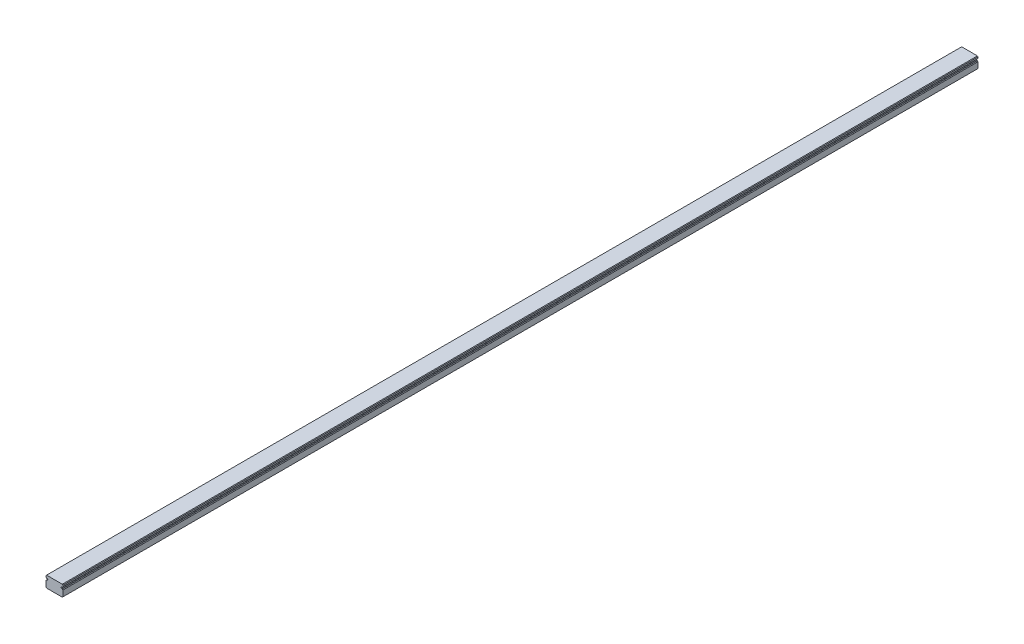
ISO-10303-21;
HEADER;
FILE_DESCRIPTION(('STEP AP214'),'2;1');
FILE_NAME('part.step','',(''),(''),'','','');
FILE_SCHEMA(('AUTOMOTIVE_DESIGN { 1 0 10303 214 1 1 1 1 }'));
ENDSEC;
DATA;
#1=APPLICATION_CONTEXT('core data for automotive mechanical design processes');
#2=APPLICATION_PROTOCOL_DEFINITION('international standard','automotive_design',2000,#1);
#3=PRODUCT_CONTEXT('',#1,'mechanical');
#4=PRODUCT('Part','Part','',(#3));
#5=PRODUCT_RELATED_PRODUCT_CATEGORY('part','',(#4));
#6=PRODUCT_DEFINITION_FORMATION('','',#4);
#7=PRODUCT_DEFINITION_CONTEXT('part definition',#1,'design');
#8=PRODUCT_DEFINITION('design','',#6,#7);
#9=PRODUCT_DEFINITION_SHAPE('','',#8);
#10=(LENGTH_UNIT() NAMED_UNIT(*) SI_UNIT(.MILLI.,.METRE.));
#11=(NAMED_UNIT(*) PLANE_ANGLE_UNIT() SI_UNIT($,.RADIAN.));
#12=(NAMED_UNIT(*) SI_UNIT($,.STERADIAN.) SOLID_ANGLE_UNIT());
#13=UNCERTAINTY_MEASURE_WITH_UNIT(LENGTH_MEASURE(1.E-05),#10,'distance_accuracy_value','');
#14=(GEOMETRIC_REPRESENTATION_CONTEXT(3) GLOBAL_UNCERTAINTY_ASSIGNED_CONTEXT((#13)) GLOBAL_UNIT_ASSIGNED_CONTEXT((#10,
#11,#12)) REPRESENTATION_CONTEXT('',''));
#15=CARTESIAN_POINT('',(0.,0.,0.));
#16=DIRECTION('',(0.,0.,1.));
#17=DIRECTION('',(1.,0.,0.));
#18=AXIS2_PLACEMENT_3D('',#15,#16,#17);
#19=CARTESIAN_POINT('',(-6.00672673016138,1.01169823756327,-325.));
#20=DIRECTION('',(0.,0.,1.));
#21=DIRECTION('',(1.,0.,0.));
#22=AXIS2_PLACEMENT_3D('',#19,#20,#21);
#23=CYLINDRICAL_SURFACE('',#22,0.400000000148);
#24=CARTESIAN_POINT('',(-6.00672673016138,1.01169823756327,325.));
#25=DIRECTION('',(0.,0.,-1.));
#26=DIRECTION('',(1.,0.,0.));
#27=AXIS2_PLACEMENT_3D('',#24,#25,#26);
#28=CIRCLE('',#27,0.400000000148);
#29=CARTESIAN_POINT('',(-5.60677221533139,1.00566614128528,325.));
#30=VERTEX_POINT('',#29);
#31=CARTESIAN_POINT('',(-5.96271720079336,0.614126657287203,325.));
#32=VERTEX_POINT('',#31);
#33=EDGE_CURVE('E251',#30,#32,#28,.T.);
#34=ORIENTED_EDGE('',*,*,#33,.F.);
#35=DIRECTION('',(0.,0.,1.));
#36=VECTOR('',#35,1.);
#37=CARTESIAN_POINT('',(-5.60677221533139,1.00566614128528,-325.));
#38=LINE('',#37,#36);
#39=CARTESIAN_POINT('',(-5.60677221533139,1.00566614128528,-325.));
#40=VERTEX_POINT('',#39);
#41=EDGE_CURVE('E11',#40,#30,#38,.T.);
#42=ORIENTED_EDGE('',*,*,#41,.F.);
#43=CARTESIAN_POINT('',(-6.00672673016138,1.01169823756327,-325.));
#44=DIRECTION('',(0.,0.,-1.));
#45=DIRECTION('',(1.,0.,0.));
#46=AXIS2_PLACEMENT_3D('',#43,#44,#45);
#47=CIRCLE('',#46,0.400000000148);
#48=CARTESIAN_POINT('',(-5.96271720079336,0.614126657287203,-325.));
#49=VERTEX_POINT('',#48);
#50=EDGE_CURVE('E331',#40,#49,#47,.T.);
#51=ORIENTED_EDGE('',*,*,#50,.T.);
#52=DIRECTION('',(0.,0.,1.));
#53=VECTOR('',#52,1.);
#54=CARTESIAN_POINT('',(-5.96271720079336,0.614126657287203,-325.));
#55=LINE('',#54,#53);
#56=EDGE_CURVE('E37',#49,#32,#55,.T.);
#57=ORIENTED_EDGE('',*,*,#56,.T.);
#58=EDGE_LOOP('',(#34,#42,#51,#57));
#59=FACE_BOUND('',#58,.T.);
#60=ADVANCED_FACE('F34',(#59),#23,.F.);
#61=CARTESIAN_POINT('',(-5.500000002035,1.1231155759159,-325.));
#62=DIRECTION('',(-0.73994007340902,0.672672793981928,0.));
#63=DIRECTION('',(-0.672672793981928,-0.73994007340902,0.));
#64=AXIS2_PLACEMENT_3D('',#61,#62,#63);
#65=PLANE('',#64);
#66=DIRECTION('',(-0.672672793981928,-0.73994007340902,0.));
#67=VECTOR('',#66,1.);
#68=CARTESIAN_POINT('',(-5.500000002035,1.1231155759159,325.));
#69=LINE('',#68,#67);
#70=CARTESIAN_POINT('',(-5.500000002035,1.1231155759159,325.));
#71=VERTEX_POINT('',#70);
#72=EDGE_CURVE('E329',#71,#30,#69,.T.);
#73=ORIENTED_EDGE('',*,*,#72,.F.);
#74=DIRECTION('',(0.,0.,1.));
#75=VECTOR('',#74,1.);
#76=CARTESIAN_POINT('',(-5.500000002035,1.1231155759159,-325.));
#77=LINE('',#76,#75);
#78=CARTESIAN_POINT('',(-5.500000002035,1.1231155759159,-325.));
#79=VERTEX_POINT('',#78);
#80=EDGE_CURVE('E43',#79,#71,#77,.T.);
#81=ORIENTED_EDGE('',*,*,#80,.F.);
#82=DIRECTION('',(-0.672672793981928,-0.73994007340902,0.));
#83=VECTOR('',#82,1.);
#84=CARTESIAN_POINT('',(-5.500000002035,1.1231155759159,-325.));
#85=LINE('',#84,#83);
#86=EDGE_CURVE('E241',#79,#40,#85,.T.);
#87=ORIENTED_EDGE('',*,*,#86,.T.);
#88=ORIENTED_EDGE('',*,*,#41,.T.);
#89=EDGE_LOOP('',(#73,#81,#87,#88));
#90=FACE_BOUND('',#89,.T.);
#91=ADVANCED_FACE('F383',(#90),#65,.T.);
#92=CARTESIAN_POINT('',(-5.200000001924,1.1231155759159,-325.));
#93=DIRECTION('',(0.,1.,0.));
#94=DIRECTION('',(0.,0.,1.));
#95=AXIS2_PLACEMENT_3D('',#92,#93,#94);
#96=PLANE('',#95);
#97=DIRECTION('',(-1.,0.,0.));
#98=VECTOR('',#97,1.);
#99=CARTESIAN_POINT('',(-5.200000001924,1.1231155759159,325.));
#100=LINE('',#99,#98);
#101=CARTESIAN_POINT('',(-5.200000001924,1.1231155759159,325.));
#102=VERTEX_POINT('',#101);
#103=EDGE_CURVE('E228',#102,#71,#100,.T.);
#104=ORIENTED_EDGE('',*,*,#103,.F.);
#105=DIRECTION('',(0.,0.,1.));
#106=VECTOR('',#105,1.);
#107=CARTESIAN_POINT('',(-5.200000001924,1.1231155759159,-325.));
#108=LINE('',#107,#106);
#109=CARTESIAN_POINT('',(-5.200000001924,1.1231155759159,-325.));
#110=VERTEX_POINT('',#109);
#111=EDGE_CURVE('E223',#110,#102,#108,.T.);
#112=ORIENTED_EDGE('',*,*,#111,.F.);
#113=DIRECTION('',(-1.,0.,0.));
#114=VECTOR('',#113,1.);
#115=CARTESIAN_POINT('',(-5.200000001924,1.1231155759159,-325.));
#116=LINE('',#115,#114);
#117=EDGE_CURVE('E226',#110,#79,#116,.T.);
#118=ORIENTED_EDGE('',*,*,#117,.T.);
#119=ORIENTED_EDGE('',*,*,#80,.T.);
#120=EDGE_LOOP('',(#104,#112,#118,#119));
#121=FACE_BOUND('',#120,.T.);
#122=ADVANCED_FACE('F225',(#121),#96,.T.);
#123=CARTESIAN_POINT('',(-5.200000001924,1.5731155760824,-325.));
#124=DIRECTION('',(0.,0.,1.));
#125=DIRECTION('',(1.,0.,0.));
#126=AXIS2_PLACEMENT_3D('',#123,#124,#125);
#127=CYLINDRICAL_SURFACE('',#126,0.450000000166499);
#128=CARTESIAN_POINT('',(-5.200000001924,1.5731155760824,325.));
#129=DIRECTION('',(0.,0.,-1.));
#130=DIRECTION('',(1.,0.,0.));
#131=AXIS2_PLACEMENT_3D('',#128,#129,#130);
#132=CIRCLE('',#131,0.450000000166499);
#133=CARTESIAN_POINT('',(-5.200000001924,2.0231155762489,325.));
#134=VERTEX_POINT('',#133);
#135=EDGE_CURVE('E326',#134,#102,#132,.T.);
#136=ORIENTED_EDGE('',*,*,#135,.F.);
#137=DIRECTION('',(0.,0.,1.));
#138=VECTOR('',#137,1.);
#139=CARTESIAN_POINT('',(-5.200000001924,2.0231155762489,-325.));
#140=LINE('',#139,#138);
#141=CARTESIAN_POINT('',(-5.200000001924,2.0231155762489,-325.));
#142=VERTEX_POINT('',#141);
#143=EDGE_CURVE('E233',#142,#134,#140,.T.);
#144=ORIENTED_EDGE('',*,*,#143,.F.);
#145=CARTESIAN_POINT('',(-5.200000001924,1.5731155760824,-325.));
#146=DIRECTION('',(0.,0.,-1.));
#147=DIRECTION('',(1.,0.,0.));
#148=AXIS2_PLACEMENT_3D('',#145,#146,#147);
#149=CIRCLE('',#148,0.450000000166499);
#150=EDGE_CURVE('E239',#142,#110,#149,.T.);
#151=ORIENTED_EDGE('',*,*,#150,.T.);
#152=ORIENTED_EDGE('',*,*,#111,.T.);
#153=EDGE_LOOP('',(#136,#144,#151,#152));
#154=FACE_BOUND('',#153,.T.);
#155=ADVANCED_FACE('F243',(#154),#127,.F.);
#156=CARTESIAN_POINT('',(-5.500000002035,2.0231155762489,-325.));
#157=DIRECTION('',(0.,-1.,0.));
#158=DIRECTION('',(0.,0.,-1.));
#159=AXIS2_PLACEMENT_3D('',#156,#157,#158);
#160=PLANE('',#159);
#161=DIRECTION('',(1.,0.,0.));
#162=VECTOR('',#161,1.);
#163=CARTESIAN_POINT('',(-5.500000002035,2.0231155762489,325.));
#164=LINE('',#163,#162);
#165=CARTESIAN_POINT('',(-5.500000002035,2.0231155762489,325.));
#166=VERTEX_POINT('',#165);
#167=EDGE_CURVE('E323',#166,#134,#164,.T.);
#168=ORIENTED_EDGE('',*,*,#167,.F.);
#169=DIRECTION('',(0.,0.,1.));
#170=VECTOR('',#169,1.);
#171=CARTESIAN_POINT('',(-5.500000002035,2.0231155762489,-325.));
#172=LINE('',#171,#170);
#173=CARTESIAN_POINT('',(-5.500000002035,2.0231155762489,-325.));
#174=VERTEX_POINT('',#173);
#175=EDGE_CURVE('E335',#174,#166,#172,.T.);
#176=ORIENTED_EDGE('',*,*,#175,.F.);
#177=DIRECTION('',(1.,0.,0.));
#178=VECTOR('',#177,1.);
#179=CARTESIAN_POINT('',(-5.500000002035,2.0231155762489,-325.));
#180=LINE('',#179,#178);
#181=EDGE_CURVE('E244',#174,#142,#180,.T.);
#182=ORIENTED_EDGE('',*,*,#181,.T.);
#183=ORIENTED_EDGE('',*,*,#143,.T.);
#184=EDGE_LOOP('',(#168,#176,#182,#183));
#185=FACE_BOUND('',#184,.T.);
#186=ADVANCED_FACE('F396',(#185),#160,.T.);
#187=CARTESIAN_POINT('',(-5.60677221533139,2.14056501087033,-325.));
#188=DIRECTION('',(-0.73994007338286,-0.672672794010704,0.));
#189=DIRECTION('',(0.672672794010704,-0.73994007338286,0.));
#190=AXIS2_PLACEMENT_3D('',#187,#188,#189);
#191=PLANE('',#190);
#192=DIRECTION('',(0.672672794010704,-0.73994007338286,0.));
#193=VECTOR('',#192,1.);
#194=CARTESIAN_POINT('',(-5.60677221533139,2.14056501087033,325.));
#195=LINE('',#194,#193);
#196=CARTESIAN_POINT('',(-5.60677221533139,2.14056501087033,325.));
#197=VERTEX_POINT('',#196);
#198=EDGE_CURVE('E320',#197,#166,#195,.T.);
#199=ORIENTED_EDGE('',*,*,#198,.F.);
#200=DIRECTION('',(0.,0.,1.));
#201=VECTOR('',#200,1.);
#202=CARTESIAN_POINT('',(-5.60677221533139,2.14056501087033,-325.));
#203=LINE('',#202,#201);
#204=CARTESIAN_POINT('',(-5.60677221533139,2.14056501087033,-325.));
#205=VERTEX_POINT('',#204);
#206=EDGE_CURVE('E337',#205,#197,#203,.T.);
#207=ORIENTED_EDGE('',*,*,#206,.F.);
#208=DIRECTION('',(0.672672794010704,-0.73994007338286,0.));
#209=VECTOR('',#208,1.);
#210=CARTESIAN_POINT('',(-5.60677221533139,2.14056501087033,-325.));
#211=LINE('',#210,#209);
#212=EDGE_CURVE('E246',#205,#174,#211,.T.);
#213=ORIENTED_EDGE('',*,*,#212,.T.);
#214=ORIENTED_EDGE('',*,*,#175,.T.);
#215=EDGE_LOOP('',(#199,#207,#213,#214));
#216=FACE_BOUND('',#215,.T.);
#217=ADVANCED_FACE('F399',(#216),#191,.T.);
#218=CARTESIAN_POINT('',(-6.00672673016152,2.13453291460154,-325.));
#219=DIRECTION('',(0.,0.,1.));
#220=DIRECTION('',(1.,0.,0.));
#221=AXIS2_PLACEMENT_3D('',#218,#219,#220);
#222=CYLINDRICAL_SURFACE('',#221,0.400000000148002);
#223=CARTESIAN_POINT('',(-6.00672673016152,2.13453291460154,325.));
#224=DIRECTION('',(0.,0.,-1.));
#225=DIRECTION('',(1.,0.,0.));
#226=AXIS2_PLACEMENT_3D('',#223,#224,#225);
#227=CIRCLE('',#226,0.400000000148002);
#228=CARTESIAN_POINT('',(-5.96271720079336,2.53210449487759,325.));
#229=VERTEX_POINT('',#228);
#230=EDGE_CURVE('E317',#229,#197,#227,.T.);
#231=ORIENTED_EDGE('',*,*,#230,.F.);
#232=DIRECTION('',(0.,0.,1.));
#233=VECTOR('',#232,1.);
#234=CARTESIAN_POINT('',(-5.96271720079336,2.53210449487759,-325.));
#235=LINE('',#234,#233);
#236=CARTESIAN_POINT('',(-5.96271720079336,2.53210449487759,-325.));
#237=VERTEX_POINT('',#236);
#238=EDGE_CURVE('E339',#237,#229,#235,.T.);
#239=ORIENTED_EDGE('',*,*,#238,.F.);
#240=CARTESIAN_POINT('',(-6.00672673016152,2.13453291460154,-325.));
#241=DIRECTION('',(0.,0.,-1.));
#242=DIRECTION('',(1.,0.,0.));
#243=AXIS2_PLACEMENT_3D('',#240,#241,#242);
#244=CIRCLE('',#243,0.400000000148002);
#245=EDGE_CURVE('E744',#237,#205,#244,.T.);
#246=ORIENTED_EDGE('',*,*,#245,.T.);
#247=ORIENTED_EDGE('',*,*,#206,.T.);
#248=EDGE_LOOP('',(#231,#239,#246,#247));
#249=FACE_BOUND('',#248,.T.);
#250=ADVANCED_FACE('F403',(#249),#222,.F.);
#251=CARTESIAN_POINT('',(-6.00000000222,2.5731155764524,-325.));
#252=DIRECTION('',(-0.739940073440895,-0.672672793946866,0.));
#253=DIRECTION('',(0.672672793946866,-0.739940073440895,0.));
#254=AXIS2_PLACEMENT_3D('',#251,#252,#253);
#255=PLANE('',#254);
#256=DIRECTION('',(0.672672793946866,-0.739940073440895,0.));
#257=VECTOR('',#256,1.);
#258=CARTESIAN_POINT('',(-6.00000000222,2.5731155764524,325.));
#259=LINE('',#258,#257);
#260=CARTESIAN_POINT('',(-6.00000000222,2.5731155764524,325.));
#261=VERTEX_POINT('',#260);
#262=EDGE_CURVE('E314',#261,#229,#259,.T.);
#263=ORIENTED_EDGE('',*,*,#262,.F.);
#264=DIRECTION('',(0.,0.,1.));
#265=VECTOR('',#264,1.);
#266=CARTESIAN_POINT('',(-6.00000000222,2.5731155764524,-325.));
#267=LINE('',#266,#265);
#268=CARTESIAN_POINT('',(-6.00000000222,2.5731155764524,-325.));
#269=VERTEX_POINT('',#268);
#270=EDGE_CURVE('E341',#269,#261,#267,.T.);
#271=ORIENTED_EDGE('',*,*,#270,.F.);
#272=DIRECTION('',(0.672672793946866,-0.739940073440895,0.));
#273=VECTOR('',#272,1.);
#274=CARTESIAN_POINT('',(-6.00000000222,2.5731155764524,-325.));
#275=LINE('',#274,#273);
#276=EDGE_CURVE('E740',#269,#237,#275,.T.);
#277=ORIENTED_EDGE('',*,*,#276,.T.);
#278=ORIENTED_EDGE('',*,*,#238,.T.);
#279=EDGE_LOOP('',(#263,#271,#277,#278));
#280=FACE_BOUND('',#279,.T.);
#281=ADVANCED_FACE('F407',(#280),#255,.T.);
#282=CARTESIAN_POINT('',(-6.00000000222,3.5731155768224,-325.));
#283=DIRECTION('',(-1.,0.,0.));
#284=DIRECTION('',(0.,0.,1.));
#285=AXIS2_PLACEMENT_3D('',#282,#283,#284);
#286=PLANE('',#285);
#287=DIRECTION('',(0.,-1.,0.));
#288=VECTOR('',#287,1.);
#289=CARTESIAN_POINT('',(-6.00000000222,3.5731155768224,325.));
#290=LINE('',#289,#288);
#291=CARTESIAN_POINT('',(-6.00000000222,3.5731155768224,325.));
#292=VERTEX_POINT('',#291);
#293=EDGE_CURVE('E311',#292,#261,#290,.T.);
#294=ORIENTED_EDGE('',*,*,#293,.F.);
#295=DIRECTION('',(0.,0.,1.));
#296=VECTOR('',#295,1.);
#297=CARTESIAN_POINT('',(-6.00000000222,3.5731155768224,-325.));
#298=LINE('',#297,#296);
#299=CARTESIAN_POINT('',(-6.00000000222,3.5731155768224,-325.));
#300=VERTEX_POINT('',#299);
#301=EDGE_CURVE('E343',#300,#292,#298,.T.);
#302=ORIENTED_EDGE('',*,*,#301,.F.);
#303=DIRECTION('',(0.,-1.,0.));
#304=VECTOR('',#303,1.);
#305=CARTESIAN_POINT('',(-6.00000000222,3.5731155768224,-325.));
#306=LINE('',#305,#304);
#307=EDGE_CURVE('E751',#300,#269,#306,.T.);
#308=ORIENTED_EDGE('',*,*,#307,.T.);
#309=ORIENTED_EDGE('',*,*,#270,.T.);
#310=EDGE_LOOP('',(#294,#302,#308,#309));
#311=FACE_BOUND('',#310,.T.);
#312=ADVANCED_FACE('F411',(#311),#286,.T.);
#313=CARTESIAN_POINT('',(-5.600000002072,3.9731155769704,-325.));
#314=DIRECTION('',(-0.707106781186548,0.707106781186548,0.));
#315=DIRECTION('',(-0.707106781186548,-0.707106781186548,0.));
#316=AXIS2_PLACEMENT_3D('',#313,#314,#315);
#317=PLANE('',#316);
#318=DIRECTION('',(-0.707106781186548,-0.707106781186548,0.));
#319=VECTOR('',#318,1.);
#320=CARTESIAN_POINT('',(-5.600000002072,3.9731155769704,325.));
#321=LINE('',#320,#319);
#322=CARTESIAN_POINT('',(-5.600000002072,3.9731155769704,325.));
#323=VERTEX_POINT('',#322);
#324=EDGE_CURVE('E308',#323,#292,#321,.T.);
#325=ORIENTED_EDGE('',*,*,#324,.F.);
#326=DIRECTION('',(0.,0.,1.));
#327=VECTOR('',#326,1.);
#328=CARTESIAN_POINT('',(-5.600000002072,3.9731155769704,-325.));
#329=LINE('',#328,#327);
#330=CARTESIAN_POINT('',(-5.600000002072,3.9731155769704,-325.));
#331=VERTEX_POINT('',#330);
#332=EDGE_CURVE('E345',#331,#323,#329,.T.);
#333=ORIENTED_EDGE('',*,*,#332,.F.);
#334=DIRECTION('',(-0.707106781186548,-0.707106781186548,0.));
#335=VECTOR('',#334,1.);
#336=CARTESIAN_POINT('',(-5.600000002072,3.9731155769704,-325.));
#337=LINE('',#336,#335);
#338=EDGE_CURVE('E733',#331,#300,#337,.T.);
#339=ORIENTED_EDGE('',*,*,#338,.T.);
#340=ORIENTED_EDGE('',*,*,#301,.T.);
#341=EDGE_LOOP('',(#325,#333,#339,#340));
#342=FACE_BOUND('',#341,.T.);
#343=ADVANCED_FACE('F415',(#342),#317,.T.);
#344=CARTESIAN_POINT('',(5.60000000207195,3.9731155769704,-325.));
#345=DIRECTION('',(0.,1.,0.));
#346=DIRECTION('',(-1.,0.,0.));
#347=AXIS2_PLACEMENT_3D('',#344,#345,#346);
#348=PLANE('',#347);
#349=DIRECTION('',(-1.,0.,0.));
#350=VECTOR('',#349,1.);
#351=CARTESIAN_POINT('',(5.60000000207195,3.9731155769704,325.));
#352=LINE('',#351,#350);
#353=CARTESIAN_POINT('',(5.60000000207195,3.9731155769704,325.));
#354=VERTEX_POINT('',#353);
#355=EDGE_CURVE('E305',#354,#323,#352,.T.);
#356=ORIENTED_EDGE('',*,*,#355,.F.);
#357=DIRECTION('',(0.,0.,1.));
#358=VECTOR('',#357,1.);
#359=CARTESIAN_POINT('',(5.60000000207195,3.9731155769704,-325.));
#360=LINE('',#359,#358);
#361=CARTESIAN_POINT('',(5.60000000207195,3.9731155769704,-325.));
#362=VERTEX_POINT('',#361);
#363=EDGE_CURVE('E347',#362,#354,#360,.T.);
#364=ORIENTED_EDGE('',*,*,#363,.F.);
#365=DIRECTION('',(-1.,0.,0.));
#366=VECTOR('',#365,1.);
#367=CARTESIAN_POINT('',(5.60000000207195,3.9731155769704,-325.));
#368=LINE('',#367,#366);
#369=EDGE_CURVE('E729',#362,#331,#368,.T.);
#370=ORIENTED_EDGE('',*,*,#369,.T.);
#371=ORIENTED_EDGE('',*,*,#332,.T.);
#372=EDGE_LOOP('',(#356,#364,#370,#371));
#373=FACE_BOUND('',#372,.T.);
#374=ADVANCED_FACE('F419',(#373),#348,.T.);
#375=CARTESIAN_POINT('',(6.00000000222,3.57311557682235,-325.));
#376=DIRECTION('',(0.707106781186544,0.707106781186551,0.));
#377=DIRECTION('',(-0.707106781186551,0.707106781186544,0.));
#378=AXIS2_PLACEMENT_3D('',#375,#376,#377);
#379=PLANE('',#378);
#380=DIRECTION('',(-0.707106781186551,0.707106781186544,0.));
#381=VECTOR('',#380,1.);
#382=CARTESIAN_POINT('',(6.00000000222,3.57311557682235,325.));
#383=LINE('',#382,#381);
#384=CARTESIAN_POINT('',(6.00000000222,3.57311557682235,325.));
#385=VERTEX_POINT('',#384);
#386=EDGE_CURVE('E302',#385,#354,#383,.T.);
#387=ORIENTED_EDGE('',*,*,#386,.F.);
#388=DIRECTION('',(0.,0.,1.));
#389=VECTOR('',#388,1.);
#390=CARTESIAN_POINT('',(6.00000000222,3.57311557682235,-325.));
#391=LINE('',#390,#389);
#392=CARTESIAN_POINT('',(6.00000000222,3.57311557682235,-325.));
#393=VERTEX_POINT('',#392);
#394=EDGE_CURVE('E349',#393,#385,#391,.T.);
#395=ORIENTED_EDGE('',*,*,#394,.F.);
#396=DIRECTION('',(-0.707106781186551,0.707106781186544,0.));
#397=VECTOR('',#396,1.);
#398=CARTESIAN_POINT('',(6.00000000222,3.57311557682235,-325.));
#399=LINE('',#398,#397);
#400=EDGE_CURVE('E755',#393,#362,#399,.T.);
#401=ORIENTED_EDGE('',*,*,#400,.T.);
#402=ORIENTED_EDGE('',*,*,#363,.T.);
#403=EDGE_LOOP('',(#387,#395,#401,#402));
#404=FACE_BOUND('',#403,.T.);
#405=ADVANCED_FACE('F423',(#404),#379,.T.);
#406=CARTESIAN_POINT('',(6.00000000222,2.5731155764524,-325.));
#407=DIRECTION('',(1.,0.,0.));
#408=DIRECTION('',(0.,0.,-1.));
#409=AXIS2_PLACEMENT_3D('',#406,#407,#408);
#410=PLANE('',#409);
#411=DIRECTION('',(0.,1.,0.));
#412=VECTOR('',#411,1.);
#413=CARTESIAN_POINT('',(6.00000000222,2.5731155764524,325.));
#414=LINE('',#413,#412);
#415=CARTESIAN_POINT('',(6.00000000222,2.5731155764524,325.));
#416=VERTEX_POINT('',#415);
#417=EDGE_CURVE('E299',#416,#385,#414,.T.);
#418=ORIENTED_EDGE('',*,*,#417,.F.);
#419=DIRECTION('',(0.,0.,1.));
#420=VECTOR('',#419,1.);
#421=CARTESIAN_POINT('',(6.00000000222,2.5731155764524,-325.));
#422=LINE('',#421,#420);
#423=CARTESIAN_POINT('',(6.00000000222,2.5731155764524,-325.));
#424=VERTEX_POINT('',#423);
#425=EDGE_CURVE('E351',#424,#416,#422,.T.);
#426=ORIENTED_EDGE('',*,*,#425,.F.);
#427=DIRECTION('',(0.,1.,0.));
#428=VECTOR('',#427,1.);
#429=CARTESIAN_POINT('',(6.00000000222,2.5731155764524,-325.));
#430=LINE('',#429,#428);
#431=EDGE_CURVE('E722',#424,#393,#430,.T.);
#432=ORIENTED_EDGE('',*,*,#431,.T.);
#433=ORIENTED_EDGE('',*,*,#394,.T.);
#434=EDGE_LOOP('',(#418,#426,#432,#433));
#435=FACE_BOUND('',#434,.T.);
#436=ADVANCED_FACE('F427',(#435),#410,.T.);
#437=CARTESIAN_POINT('',(5.96271720079336,2.53210449487759,-325.));
#438=DIRECTION('',(0.739940073440895,-0.672672793946866,0.));
#439=DIRECTION('',(0.672672793946866,0.739940073440895,0.));
#440=AXIS2_PLACEMENT_3D('',#437,#438,#439);
#441=PLANE('',#440);
#442=DIRECTION('',(0.672672793946866,0.739940073440895,0.));
#443=VECTOR('',#442,1.);
#444=CARTESIAN_POINT('',(5.96271720079336,2.53210449487759,325.));
#445=LINE('',#444,#443);
#446=CARTESIAN_POINT('',(5.96271720079336,2.53210449487759,325.));
#447=VERTEX_POINT('',#446);
#448=EDGE_CURVE('E296',#447,#416,#445,.T.);
#449=ORIENTED_EDGE('',*,*,#448,.F.);
#450=DIRECTION('',(0.,0.,1.));
#451=VECTOR('',#450,1.);
#452=CARTESIAN_POINT('',(5.96271720079336,2.53210449487759,-325.));
#453=LINE('',#452,#451);
#454=CARTESIAN_POINT('',(5.96271720079336,2.53210449487759,-325.));
#455=VERTEX_POINT('',#454);
#456=EDGE_CURVE('E353',#455,#447,#453,.T.);
#457=ORIENTED_EDGE('',*,*,#456,.F.);
#458=DIRECTION('',(0.672672793946866,0.739940073440895,0.));
#459=VECTOR('',#458,1.);
#460=CARTESIAN_POINT('',(5.96271720079336,2.53210449487759,-325.));
#461=LINE('',#460,#459);
#462=EDGE_CURVE('E718',#455,#424,#461,.T.);
#463=ORIENTED_EDGE('',*,*,#462,.T.);
#464=ORIENTED_EDGE('',*,*,#425,.T.);
#465=EDGE_LOOP('',(#449,#457,#463,#464));
#466=FACE_BOUND('',#465,.T.);
#467=ADVANCED_FACE('F431',(#466),#441,.T.);
#468=CARTESIAN_POINT('',(6.00672673016152,2.13453291460154,-325.));
#469=DIRECTION('',(0.,0.,1.));
#470=DIRECTION('',(1.,0.,0.));
#471=AXIS2_PLACEMENT_3D('',#468,#469,#470);
#472=CYLINDRICAL_SURFACE('',#471,0.400000000148);
#473=CARTESIAN_POINT('',(6.00672673016152,2.13453291460154,325.));
#474=DIRECTION('',(0.,0.,-1.));
#475=DIRECTION('',(1.,0.,0.));
#476=AXIS2_PLACEMENT_3D('',#473,#474,#475);
#477=CIRCLE('',#476,0.400000000148);
#478=CARTESIAN_POINT('',(5.60677221533139,2.14056501087033,325.));
#479=VERTEX_POINT('',#478);
#480=EDGE_CURVE('E293',#479,#447,#477,.T.);
#481=ORIENTED_EDGE('',*,*,#480,.F.);
#482=DIRECTION('',(0.,0.,1.));
#483=VECTOR('',#482,1.);
#484=CARTESIAN_POINT('',(5.60677221533139,2.14056501087033,-325.));
#485=LINE('',#484,#483);
#486=CARTESIAN_POINT('',(5.60677221533139,2.14056501087033,-325.));
#487=VERTEX_POINT('',#486);
#488=EDGE_CURVE('E355',#487,#479,#485,.T.);
#489=ORIENTED_EDGE('',*,*,#488,.F.);
#490=CARTESIAN_POINT('',(6.00672673016152,2.13453291460154,-325.));
#491=DIRECTION('',(0.,0.,-1.));
#492=DIRECTION('',(1.,0.,0.));
#493=AXIS2_PLACEMENT_3D('',#490,#491,#492);
#494=CIRCLE('',#493,0.400000000148);
#495=EDGE_CURVE('E759',#487,#455,#494,.T.);
#496=ORIENTED_EDGE('',*,*,#495,.T.);
#497=ORIENTED_EDGE('',*,*,#456,.T.);
#498=EDGE_LOOP('',(#481,#489,#496,#497));
#499=FACE_BOUND('',#498,.T.);
#500=ADVANCED_FACE('F435',(#499),#472,.F.);
#501=CARTESIAN_POINT('',(5.500000002035,2.0231155762489,-325.));
#502=DIRECTION('',(0.739940073382854,-0.672672794010711,0.));
#503=DIRECTION('',(0.672672794010711,0.739940073382854,0.));
#504=AXIS2_PLACEMENT_3D('',#501,#502,#503);
#505=PLANE('',#504);
#506=DIRECTION('',(0.672672794010711,0.739940073382854,0.));
#507=VECTOR('',#506,1.);
#508=CARTESIAN_POINT('',(5.500000002035,2.0231155762489,325.));
#509=LINE('',#508,#507);
#510=CARTESIAN_POINT('',(5.500000002035,2.0231155762489,325.));
#511=VERTEX_POINT('',#510);
#512=EDGE_CURVE('E290',#511,#479,#509,.T.);
#513=ORIENTED_EDGE('',*,*,#512,.F.);
#514=DIRECTION('',(0.,0.,1.));
#515=VECTOR('',#514,1.);
#516=CARTESIAN_POINT('',(5.500000002035,2.0231155762489,-325.));
#517=LINE('',#516,#515);
#518=CARTESIAN_POINT('',(5.500000002035,2.0231155762489,-325.));
#519=VERTEX_POINT('',#518);
#520=EDGE_CURVE('E357',#519,#511,#517,.T.);
#521=ORIENTED_EDGE('',*,*,#520,.F.);
#522=DIRECTION('',(0.672672794010711,0.739940073382854,0.));
#523=VECTOR('',#522,1.);
#524=CARTESIAN_POINT('',(5.500000002035,2.0231155762489,-325.));
#525=LINE('',#524,#523);
#526=EDGE_CURVE('E711',#519,#487,#525,.T.);
#527=ORIENTED_EDGE('',*,*,#526,.T.);
#528=ORIENTED_EDGE('',*,*,#488,.T.);
#529=EDGE_LOOP('',(#513,#521,#527,#528));
#530=FACE_BOUND('',#529,.T.);
#531=ADVANCED_FACE('F439',(#530),#505,.T.);
#532=CARTESIAN_POINT('',(5.200000001924,2.0231155762489,-325.));
#533=DIRECTION('',(0.,-1.,0.));
#534=DIRECTION('',(0.,0.,-1.));
#535=AXIS2_PLACEMENT_3D('',#532,#533,#534);
#536=PLANE('',#535);
#537=DIRECTION('',(1.,0.,0.));
#538=VECTOR('',#537,1.);
#539=CARTESIAN_POINT('',(5.200000001924,2.0231155762489,325.));
#540=LINE('',#539,#538);
#541=CARTESIAN_POINT('',(5.200000001924,2.0231155762489,325.));
#542=VERTEX_POINT('',#541);
#543=EDGE_CURVE('E287',#542,#511,#540,.T.);
#544=ORIENTED_EDGE('',*,*,#543,.F.);
#545=DIRECTION('',(0.,0.,1.));
#546=VECTOR('',#545,1.);
#547=CARTESIAN_POINT('',(5.200000001924,2.0231155762489,-325.));
#548=LINE('',#547,#546);
#549=CARTESIAN_POINT('',(5.200000001924,2.0231155762489,-325.));
#550=VERTEX_POINT('',#549);
#551=EDGE_CURVE('E359',#550,#542,#548,.T.);
#552=ORIENTED_EDGE('',*,*,#551,.F.);
#553=DIRECTION('',(1.,0.,0.));
#554=VECTOR('',#553,1.);
#555=CARTESIAN_POINT('',(5.200000001924,2.0231155762489,-325.));
#556=LINE('',#555,#554);
#557=EDGE_CURVE('E707',#550,#519,#556,.T.);
#558=ORIENTED_EDGE('',*,*,#557,.T.);
#559=ORIENTED_EDGE('',*,*,#520,.T.);
#560=EDGE_LOOP('',(#544,#552,#558,#559));
#561=FACE_BOUND('',#560,.T.);
#562=ADVANCED_FACE('F443',(#561),#536,.T.);
#563=CARTESIAN_POINT('',(5.200000001924,1.5731155760824,-325.));
#564=DIRECTION('',(0.,0.,1.));
#565=DIRECTION('',(1.,0.,0.));
#566=AXIS2_PLACEMENT_3D('',#563,#564,#565);
#567=CYLINDRICAL_SURFACE('',#566,0.450000000166499);
#568=CARTESIAN_POINT('',(5.200000001924,1.5731155760824,325.));
#569=DIRECTION('',(0.,0.,-1.));
#570=DIRECTION('',(1.,0.,0.));
#571=AXIS2_PLACEMENT_3D('',#568,#569,#570);
#572=CIRCLE('',#571,0.450000000166499);
#573=CARTESIAN_POINT('',(5.200000001924,1.1231155759159,325.));
#574=VERTEX_POINT('',#573);
#575=EDGE_CURVE('E284',#574,#542,#572,.T.);
#576=ORIENTED_EDGE('',*,*,#575,.F.);
#577=DIRECTION('',(0.,0.,1.));
#578=VECTOR('',#577,1.);
#579=CARTESIAN_POINT('',(5.200000001924,1.1231155759159,-325.));
#580=LINE('',#579,#578);
#581=CARTESIAN_POINT('',(5.200000001924,1.1231155759159,-325.));
#582=VERTEX_POINT('',#581);
#583=EDGE_CURVE('E361',#582,#574,#580,.T.);
#584=ORIENTED_EDGE('',*,*,#583,.F.);
#585=CARTESIAN_POINT('',(5.200000001924,1.5731155760824,-325.));
#586=DIRECTION('',(0.,0.,-1.));
#587=DIRECTION('',(1.,0.,0.));
#588=AXIS2_PLACEMENT_3D('',#585,#586,#587);
#589=CIRCLE('',#588,0.450000000166499);
#590=EDGE_CURVE('E763',#582,#550,#589,.T.);
#591=ORIENTED_EDGE('',*,*,#590,.T.);
#592=ORIENTED_EDGE('',*,*,#551,.T.);
#593=EDGE_LOOP('',(#576,#584,#591,#592));
#594=FACE_BOUND('',#593,.T.);
#595=ADVANCED_FACE('F447',(#594),#567,.F.);
#596=CARTESIAN_POINT('',(5.500000002035,1.1231155759159,-325.));
#597=DIRECTION('',(0.,1.,0.));
#598=DIRECTION('',(0.,0.,1.));
#599=AXIS2_PLACEMENT_3D('',#596,#597,#598);
#600=PLANE('',#599);
#601=DIRECTION('',(-1.,0.,0.));
#602=VECTOR('',#601,1.);
#603=CARTESIAN_POINT('',(5.500000002035,1.1231155759159,325.));
#604=LINE('',#603,#602);
#605=CARTESIAN_POINT('',(5.500000002035,1.1231155759159,325.));
#606=VERTEX_POINT('',#605);
#607=EDGE_CURVE('E281',#606,#574,#604,.T.);
#608=ORIENTED_EDGE('',*,*,#607,.F.);
#609=DIRECTION('',(0.,0.,1.));
#610=VECTOR('',#609,1.);
#611=CARTESIAN_POINT('',(5.500000002035,1.1231155759159,-325.));
#612=LINE('',#611,#610);
#613=CARTESIAN_POINT('',(5.500000002035,1.1231155759159,-325.));
#614=VERTEX_POINT('',#613);
#615=EDGE_CURVE('E363',#614,#606,#612,.T.);
#616=ORIENTED_EDGE('',*,*,#615,.F.);
#617=DIRECTION('',(-1.,0.,0.));
#618=VECTOR('',#617,1.);
#619=CARTESIAN_POINT('',(5.500000002035,1.1231155759159,-325.));
#620=LINE('',#619,#618);
#621=EDGE_CURVE('E700',#614,#582,#620,.T.);
#622=ORIENTED_EDGE('',*,*,#621,.T.);
#623=ORIENTED_EDGE('',*,*,#583,.T.);
#624=EDGE_LOOP('',(#608,#616,#622,#623));
#625=FACE_BOUND('',#624,.T.);
#626=ADVANCED_FACE('F451',(#625),#600,.T.);
#627=CARTESIAN_POINT('',(5.60677221533139,1.00566614128528,-325.));
#628=DIRECTION('',(0.739940073409015,0.672672793981934,0.));
#629=DIRECTION('',(-0.672672793981934,0.739940073409015,0.));
#630=AXIS2_PLACEMENT_3D('',#627,#628,#629);
#631=PLANE('',#630);
#632=DIRECTION('',(-0.672672793981934,0.739940073409015,0.));
#633=VECTOR('',#632,1.);
#634=CARTESIAN_POINT('',(5.60677221533139,1.00566614128528,325.));
#635=LINE('',#634,#633);
#636=CARTESIAN_POINT('',(5.60677221533139,1.00566614128528,325.));
#637=VERTEX_POINT('',#636);
#638=EDGE_CURVE('E278',#637,#606,#635,.T.);
#639=ORIENTED_EDGE('',*,*,#638,.F.);
#640=DIRECTION('',(0.,0.,1.));
#641=VECTOR('',#640,1.);
#642=CARTESIAN_POINT('',(5.60677221533139,1.00566614128528,-325.));
#643=LINE('',#642,#641);
#644=CARTESIAN_POINT('',(5.60677221533139,1.00566614128528,-325.));
#645=VERTEX_POINT('',#644);
#646=EDGE_CURVE('E365',#645,#637,#643,.T.);
#647=ORIENTED_EDGE('',*,*,#646,.F.);
#648=DIRECTION('',(-0.672672793981934,0.739940073409015,0.));
#649=VECTOR('',#648,1.);
#650=CARTESIAN_POINT('',(5.60677221533139,1.00566614128528,-325.));
#651=LINE('',#650,#649);
#652=EDGE_CURVE('E696',#645,#614,#651,.T.);
#653=ORIENTED_EDGE('',*,*,#652,.T.);
#654=ORIENTED_EDGE('',*,*,#615,.T.);
#655=EDGE_LOOP('',(#639,#647,#653,#654));
#656=FACE_BOUND('',#655,.T.);
#657=ADVANCED_FACE('F455',(#656),#631,.T.);
#658=CARTESIAN_POINT('',(6.00672673016138,1.01169823756326,-325.));
#659=DIRECTION('',(0.,0.,1.));
#660=DIRECTION('',(1.,0.,0.));
#661=AXIS2_PLACEMENT_3D('',#658,#659,#660);
#662=CYLINDRICAL_SURFACE('',#661,0.400000000147998);
#663=CARTESIAN_POINT('',(6.00672673016138,1.01169823756326,325.));
#664=DIRECTION('',(0.,0.,-1.));
#665=DIRECTION('',(1.,0.,0.));
#666=AXIS2_PLACEMENT_3D('',#663,#664,#665);
#667=CIRCLE('',#666,0.400000000147998);
#668=CARTESIAN_POINT('',(5.96271720079336,0.614126657287203,325.));
#669=VERTEX_POINT('',#668);
#670=EDGE_CURVE('E275',#669,#637,#667,.T.);
#671=ORIENTED_EDGE('',*,*,#670,.F.);
#672=DIRECTION('',(0.,0.,1.));
#673=VECTOR('',#672,1.);
#674=CARTESIAN_POINT('',(5.96271720079336,0.614126657287203,-325.));
#675=LINE('',#674,#673);
#676=CARTESIAN_POINT('',(5.96271720079336,0.614126657287203,-325.));
#677=VERTEX_POINT('',#676);
#678=EDGE_CURVE('E367',#677,#669,#675,.T.);
#679=ORIENTED_EDGE('',*,*,#678,.F.);
#680=CARTESIAN_POINT('',(6.00672673016138,1.01169823756326,-325.));
#681=DIRECTION('',(0.,0.,-1.));
#682=DIRECTION('',(1.,0.,0.));
#683=AXIS2_PLACEMENT_3D('',#680,#681,#682);
#684=CIRCLE('',#683,0.400000000147998);
#685=EDGE_CURVE('E767',#677,#645,#684,.T.);
#686=ORIENTED_EDGE('',*,*,#685,.T.);
#687=ORIENTED_EDGE('',*,*,#646,.T.);
#688=EDGE_LOOP('',(#671,#679,#686,#687));
#689=FACE_BOUND('',#688,.T.);
#690=ADVANCED_FACE('F459',(#689),#662,.F.);
#691=CARTESIAN_POINT('',(6.00000000222,0.573115575712395,-325.));
#692=DIRECTION('',(0.739940073440881,0.672672793946882,0.));
#693=DIRECTION('',(-0.672672793946882,0.739940073440881,0.));
#694=AXIS2_PLACEMENT_3D('',#691,#692,#693);
#695=PLANE('',#694);
#696=DIRECTION('',(-0.672672793946882,0.739940073440881,0.));
#697=VECTOR('',#696,1.);
#698=CARTESIAN_POINT('',(6.00000000222,0.573115575712395,325.));
#699=LINE('',#698,#697);
#700=CARTESIAN_POINT('',(6.00000000222,0.573115575712395,325.));
#701=VERTEX_POINT('',#700);
#702=EDGE_CURVE('E272',#701,#669,#699,.T.);
#703=ORIENTED_EDGE('',*,*,#702,.F.);
#704=DIRECTION('',(0.,0.,1.));
#705=VECTOR('',#704,1.);
#706=CARTESIAN_POINT('',(6.00000000222,0.573115575712395,-325.));
#707=LINE('',#706,#705);
#708=CARTESIAN_POINT('',(6.00000000222,0.573115575712395,-325.));
#709=VERTEX_POINT('',#708);
#710=EDGE_CURVE('E369',#709,#701,#707,.T.);
#711=ORIENTED_EDGE('',*,*,#710,.F.);
#712=DIRECTION('',(-0.672672793946882,0.739940073440881,0.));
#713=VECTOR('',#712,1.);
#714=CARTESIAN_POINT('',(6.00000000222,0.573115575712395,-325.));
#715=LINE('',#714,#713);
#716=EDGE_CURVE('E689',#709,#677,#715,.T.);
#717=ORIENTED_EDGE('',*,*,#716,.T.);
#718=ORIENTED_EDGE('',*,*,#678,.T.);
#719=EDGE_LOOP('',(#703,#711,#717,#718));
#720=FACE_BOUND('',#719,.T.);
#721=ADVANCED_FACE('F463',(#720),#695,.T.);
#722=CARTESIAN_POINT('',(6.00000000222,-3.6268844258416,-325.));
#723=DIRECTION('',(1.,0.,0.));
#724=DIRECTION('',(0.,0.,-1.));
#725=AXIS2_PLACEMENT_3D('',#722,#723,#724);
#726=PLANE('',#725);
#727=DIRECTION('',(0.,1.,0.));
#728=VECTOR('',#727,1.);
#729=CARTESIAN_POINT('',(6.00000000222,-3.6268844258416,325.));
#730=LINE('',#729,#728);
#731=CARTESIAN_POINT('',(6.00000000222,-3.6268844258416,325.));
#732=VERTEX_POINT('',#731);
#733=EDGE_CURVE('E269',#732,#701,#730,.T.);
#734=ORIENTED_EDGE('',*,*,#733,.F.);
#735=DIRECTION('',(0.,0.,1.));
#736=VECTOR('',#735,1.);
#737=CARTESIAN_POINT('',(6.00000000222,-3.6268844258416,-325.));
#738=LINE('',#737,#736);
#739=CARTESIAN_POINT('',(6.00000000222,-3.6268844258416,-325.));
#740=VERTEX_POINT('',#739);
#741=EDGE_CURVE('E371',#740,#732,#738,.T.);
#742=ORIENTED_EDGE('',*,*,#741,.F.);
#743=DIRECTION('',(0.,1.,0.));
#744=VECTOR('',#743,1.);
#745=CARTESIAN_POINT('',(6.00000000222,-3.6268844258416,-325.));
#746=LINE('',#745,#744);
#747=EDGE_CURVE('E685',#740,#709,#746,.T.);
#748=ORIENTED_EDGE('',*,*,#747,.T.);
#749=ORIENTED_EDGE('',*,*,#710,.T.);
#750=EDGE_LOOP('',(#734,#742,#748,#749));
#751=FACE_BOUND('',#750,.T.);
#752=ADVANCED_FACE('F467',(#751),#726,.T.);
#753=CARTESIAN_POINT('',(5.600000002072,-4.0268844259896,-325.));
#754=DIRECTION('',(0.707106781186547,-0.707106781186548,0.));
#755=DIRECTION('',(0.707106781186548,0.707106781186547,0.));
#756=AXIS2_PLACEMENT_3D('',#753,#754,#755);
#757=PLANE('',#756);
#758=DIRECTION('',(0.707106781186548,0.707106781186547,0.));
#759=VECTOR('',#758,1.);
#760=CARTESIAN_POINT('',(5.600000002072,-4.0268844259896,325.));
#761=LINE('',#760,#759);
#762=CARTESIAN_POINT('',(5.600000002072,-4.0268844259896,325.));
#763=VERTEX_POINT('',#762);
#764=EDGE_CURVE('E266',#763,#732,#761,.T.);
#765=ORIENTED_EDGE('',*,*,#764,.F.);
#766=DIRECTION('',(0.,0.,1.));
#767=VECTOR('',#766,1.);
#768=CARTESIAN_POINT('',(5.600000002072,-4.0268844259896,-325.));
#769=LINE('',#768,#767);
#770=CARTESIAN_POINT('',(5.600000002072,-4.0268844259896,-325.));
#771=VERTEX_POINT('',#770);
#772=EDGE_CURVE('E373',#771,#763,#769,.T.);
#773=ORIENTED_EDGE('',*,*,#772,.F.);
#774=DIRECTION('',(0.707106781186548,0.707106781186547,0.));
#775=VECTOR('',#774,1.);
#776=CARTESIAN_POINT('',(5.600000002072,-4.0268844259896,-325.));
#777=LINE('',#776,#775);
#778=EDGE_CURVE('E771',#771,#740,#777,.T.);
#779=ORIENTED_EDGE('',*,*,#778,.T.);
#780=ORIENTED_EDGE('',*,*,#741,.T.);
#781=EDGE_LOOP('',(#765,#773,#779,#780));
#782=FACE_BOUND('',#781,.T.);
#783=ADVANCED_FACE('F471',(#782),#757,.T.);
#784=CARTESIAN_POINT('',(-5.600000002072,-4.0268844259896,-325.));
#785=DIRECTION('',(0.,-1.,0.));
#786=DIRECTION('',(0.,0.,-1.));
#787=AXIS2_PLACEMENT_3D('',#784,#785,#786);
#788=PLANE('',#787);
#789=DIRECTION('',(1.,0.,0.));
#790=VECTOR('',#789,1.);
#791=CARTESIAN_POINT('',(-5.600000002072,-4.0268844259896,325.));
#792=LINE('',#791,#790);
#793=CARTESIAN_POINT('',(-5.600000002072,-4.0268844259896,325.));
#794=VERTEX_POINT('',#793);
#795=EDGE_CURVE('E263',#794,#763,#792,.T.);
#796=ORIENTED_EDGE('',*,*,#795,.F.);
#797=DIRECTION('',(0.,0.,1.));
#798=VECTOR('',#797,1.);
#799=CARTESIAN_POINT('',(-5.600000002072,-4.0268844259896,-325.));
#800=LINE('',#799,#798);
#801=CARTESIAN_POINT('',(-5.600000002072,-4.0268844259896,-325.));
#802=VERTEX_POINT('',#801);
#803=EDGE_CURVE('E375',#802,#794,#800,.T.);
#804=ORIENTED_EDGE('',*,*,#803,.F.);
#805=DIRECTION('',(1.,0.,0.));
#806=VECTOR('',#805,1.);
#807=CARTESIAN_POINT('',(-5.600000002072,-4.0268844259896,-325.));
#808=LINE('',#807,#806);
#809=EDGE_CURVE('E678',#802,#771,#808,.T.);
#810=ORIENTED_EDGE('',*,*,#809,.T.);
#811=ORIENTED_EDGE('',*,*,#772,.T.);
#812=EDGE_LOOP('',(#796,#804,#810,#811));
#813=FACE_BOUND('',#812,.T.);
#814=ADVANCED_FACE('F475',(#813),#788,.T.);
#815=CARTESIAN_POINT('',(-6.00000000222,-3.6268844258416,-325.));
#816=DIRECTION('',(-0.707106781186547,-0.707106781186548,0.));
#817=DIRECTION('',(0.707106781186548,-0.707106781186547,0.));
#818=AXIS2_PLACEMENT_3D('',#815,#816,#817);
#819=PLANE('',#818);
#820=DIRECTION('',(0.707106781186548,-0.707106781186547,0.));
#821=VECTOR('',#820,1.);
#822=CARTESIAN_POINT('',(-6.00000000222,-3.6268844258416,325.));
#823=LINE('',#822,#821);
#824=CARTESIAN_POINT('',(-6.00000000222,-3.6268844258416,325.));
#825=VERTEX_POINT('',#824);
#826=EDGE_CURVE('E260',#825,#794,#823,.T.);
#827=ORIENTED_EDGE('',*,*,#826,.F.);
#828=DIRECTION('',(0.,0.,1.));
#829=VECTOR('',#828,1.);
#830=CARTESIAN_POINT('',(-6.00000000222,-3.6268844258416,-325.));
#831=LINE('',#830,#829);
#832=CARTESIAN_POINT('',(-6.00000000222,-3.6268844258416,-325.));
#833=VERTEX_POINT('',#832);
#834=EDGE_CURVE('E377',#833,#825,#831,.T.);
#835=ORIENTED_EDGE('',*,*,#834,.F.);
#836=DIRECTION('',(0.707106781186548,-0.707106781186547,0.));
#837=VECTOR('',#836,1.);
#838=CARTESIAN_POINT('',(-6.00000000222,-3.6268844258416,-325.));
#839=LINE('',#838,#837);
#840=EDGE_CURVE('E674',#833,#802,#839,.T.);
#841=ORIENTED_EDGE('',*,*,#840,.T.);
#842=ORIENTED_EDGE('',*,*,#803,.T.);
#843=EDGE_LOOP('',(#827,#835,#841,#842));
#844=FACE_BOUND('',#843,.T.);
#845=ADVANCED_FACE('F479',(#844),#819,.T.);
#846=CARTESIAN_POINT('',(-6.00000000222,0.573115575712393,-325.));
#847=DIRECTION('',(-1.,0.,0.));
#848=DIRECTION('',(0.,0.,1.));
#849=AXIS2_PLACEMENT_3D('',#846,#847,#848);
#850=PLANE('',#849);
#851=DIRECTION('',(0.,-1.,0.));
#852=VECTOR('',#851,1.);
#853=CARTESIAN_POINT('',(-6.00000000222,0.573115575712393,325.));
#854=LINE('',#853,#852);
#855=CARTESIAN_POINT('',(-6.00000000222,0.573115575712393,325.));
#856=VERTEX_POINT('',#855);
#857=EDGE_CURVE('E257',#856,#825,#854,.T.);
#858=ORIENTED_EDGE('',*,*,#857,.F.);
#859=DIRECTION('',(0.,0.,1.));
#860=VECTOR('',#859,1.);
#861=CARTESIAN_POINT('',(-6.00000000222,0.573115575712393,-325.));
#862=LINE('',#861,#860);
#863=CARTESIAN_POINT('',(-6.00000000222,0.573115575712393,-325.));
#864=VERTEX_POINT('',#863);
#865=EDGE_CURVE('E378',#864,#856,#862,.T.);
#866=ORIENTED_EDGE('',*,*,#865,.F.);
#867=DIRECTION('',(0.,-1.,0.));
#868=VECTOR('',#867,1.);
#869=CARTESIAN_POINT('',(-6.00000000222,0.573115575712393,-325.));
#870=LINE('',#869,#868);
#871=EDGE_CURVE('E775',#864,#833,#870,.T.);
#872=ORIENTED_EDGE('',*,*,#871,.T.);
#873=ORIENTED_EDGE('',*,*,#834,.T.);
#874=EDGE_LOOP('',(#858,#866,#872,#873));
#875=FACE_BOUND('',#874,.T.);
#876=ADVANCED_FACE('F483',(#875),#850,.T.);
#877=CARTESIAN_POINT('',(-5.96271720079336,0.614126657287203,-325.));
#878=DIRECTION('',(-0.739940073440895,0.672672793946866,0.));
#879=DIRECTION('',(-0.672672793946866,-0.739940073440895,0.));
#880=AXIS2_PLACEMENT_3D('',#877,#878,#879);
#881=PLANE('',#880);
#882=DIRECTION('',(-0.672672793946866,-0.739940073440895,0.));
#883=VECTOR('',#882,1.);
#884=CARTESIAN_POINT('',(-5.96271720079336,0.614126657287203,325.));
#885=LINE('',#884,#883);
#886=EDGE_CURVE('E254',#32,#856,#885,.T.);
#887=ORIENTED_EDGE('',*,*,#886,.F.);
#888=ORIENTED_EDGE('',*,*,#56,.F.);
#889=DIRECTION('',(-0.672672793946866,-0.739940073440895,0.));
#890=VECTOR('',#889,1.);
#891=CARTESIAN_POINT('',(-5.96271720079336,0.614126657287203,-325.));
#892=LINE('',#891,#890);
#893=EDGE_CURVE('E777',#49,#864,#892,.T.);
#894=ORIENTED_EDGE('',*,*,#893,.T.);
#895=ORIENTED_EDGE('',*,*,#865,.T.);
#896=EDGE_LOOP('',(#887,#888,#894,#895));
#897=FACE_BOUND('',#896,.T.);
#898=ADVANCED_FACE('F380',(#897),#881,.T.);
#899=CARTESIAN_POINT('',(-6.00672673016138,1.01169823756327,-325.));
#900=DIRECTION('',(0.,0.,1.));
#901=DIRECTION('',(1.,0.,0.));
#902=AXIS2_PLACEMENT_3D('',#899,#900,#901);
#903=PLANE('',#902);
#904=ORIENTED_EDGE('',*,*,#50,.F.);
#905=ORIENTED_EDGE('',*,*,#86,.F.);
#906=ORIENTED_EDGE('',*,*,#117,.F.);
#907=ORIENTED_EDGE('',*,*,#150,.F.);
#908=ORIENTED_EDGE('',*,*,#181,.F.);
#909=ORIENTED_EDGE('',*,*,#212,.F.);
#910=ORIENTED_EDGE('',*,*,#245,.F.);
#911=ORIENTED_EDGE('',*,*,#276,.F.);
#912=ORIENTED_EDGE('',*,*,#307,.F.);
#913=ORIENTED_EDGE('',*,*,#338,.F.);
#914=ORIENTED_EDGE('',*,*,#369,.F.);
#915=ORIENTED_EDGE('',*,*,#400,.F.);
#916=ORIENTED_EDGE('',*,*,#431,.F.);
#917=ORIENTED_EDGE('',*,*,#462,.F.);
#918=ORIENTED_EDGE('',*,*,#495,.F.);
#919=ORIENTED_EDGE('',*,*,#526,.F.);
#920=ORIENTED_EDGE('',*,*,#557,.F.);
#921=ORIENTED_EDGE('',*,*,#590,.F.);
#922=ORIENTED_EDGE('',*,*,#621,.F.);
#923=ORIENTED_EDGE('',*,*,#652,.F.);
#924=ORIENTED_EDGE('',*,*,#685,.F.);
#925=ORIENTED_EDGE('',*,*,#716,.F.);
#926=ORIENTED_EDGE('',*,*,#747,.F.);
#927=ORIENTED_EDGE('',*,*,#778,.F.);
#928=ORIENTED_EDGE('',*,*,#809,.F.);
#929=ORIENTED_EDGE('',*,*,#840,.F.);
#930=ORIENTED_EDGE('',*,*,#871,.F.);
#931=ORIENTED_EDGE('',*,*,#893,.F.);
#932=EDGE_LOOP('',(#904,#905,#906,#907,#908,#909,#910,#911,#912,#913,#914,#915,#916,#917,#918,
#919,#920,#921,#922,#923,#924,#925,#926,#927,#928,#929,#930,#931));
#933=FACE_BOUND('',#932,.T.);
#934=ADVANCED_FACE('F237',(#933),#903,.F.);
#935=CARTESIAN_POINT('',(-6.00672673016138,1.01169823756327,325.));
#936=DIRECTION('',(0.,0.,1.));
#937=DIRECTION('',(1.,0.,0.));
#938=AXIS2_PLACEMENT_3D('',#935,#936,#937);
#939=PLANE('',#938);
#940=ORIENTED_EDGE('',*,*,#33,.T.);
#941=ORIENTED_EDGE('',*,*,#886,.T.);
#942=ORIENTED_EDGE('',*,*,#857,.T.);
#943=ORIENTED_EDGE('',*,*,#826,.T.);
#944=ORIENTED_EDGE('',*,*,#795,.T.);
#945=ORIENTED_EDGE('',*,*,#764,.T.);
#946=ORIENTED_EDGE('',*,*,#733,.T.);
#947=ORIENTED_EDGE('',*,*,#702,.T.);
#948=ORIENTED_EDGE('',*,*,#670,.T.);
#949=ORIENTED_EDGE('',*,*,#638,.T.);
#950=ORIENTED_EDGE('',*,*,#607,.T.);
#951=ORIENTED_EDGE('',*,*,#575,.T.);
#952=ORIENTED_EDGE('',*,*,#543,.T.);
#953=ORIENTED_EDGE('',*,*,#512,.T.);
#954=ORIENTED_EDGE('',*,*,#480,.T.);
#955=ORIENTED_EDGE('',*,*,#448,.T.);
#956=ORIENTED_EDGE('',*,*,#417,.T.);
#957=ORIENTED_EDGE('',*,*,#386,.T.);
#958=ORIENTED_EDGE('',*,*,#355,.T.);
#959=ORIENTED_EDGE('',*,*,#324,.T.);
#960=ORIENTED_EDGE('',*,*,#293,.T.);
#961=ORIENTED_EDGE('',*,*,#262,.T.);
#962=ORIENTED_EDGE('',*,*,#230,.T.);
#963=ORIENTED_EDGE('',*,*,#198,.T.);
#964=ORIENTED_EDGE('',*,*,#167,.T.);
#965=ORIENTED_EDGE('',*,*,#135,.T.);
#966=ORIENTED_EDGE('',*,*,#103,.T.);
#967=ORIENTED_EDGE('',*,*,#72,.T.);
#968=EDGE_LOOP('',(#940,#941,#942,#943,#944,#945,#946,#947,#948,#949,#950,#951,#952,#953,#954,
#955,#956,#957,#958,#959,#960,#961,#962,#963,#964,#965,#966,#967));
#969=FACE_BOUND('',#968,.T.);
#970=ADVANCED_FACE('F382',(#969),#939,.T.);
#971=CLOSED_SHELL('',(#60,#91,#122,#155,#186,#217,#250,#281,#312,#343,#374,#405,#436,#467,#500,
#531,#562,#595,#626,#657,#690,#721,#752,#783,#814,#845,#876,#898,#934,#970));
#972=MANIFOLD_SOLID_BREP('B2',#971);
#973=ADVANCED_BREP_SHAPE_REPRESENTATION('',(#18,#972),#14);
#974=SHAPE_DEFINITION_REPRESENTATION(#9,#973);
ENDSEC;
END-ISO-10303-21;
